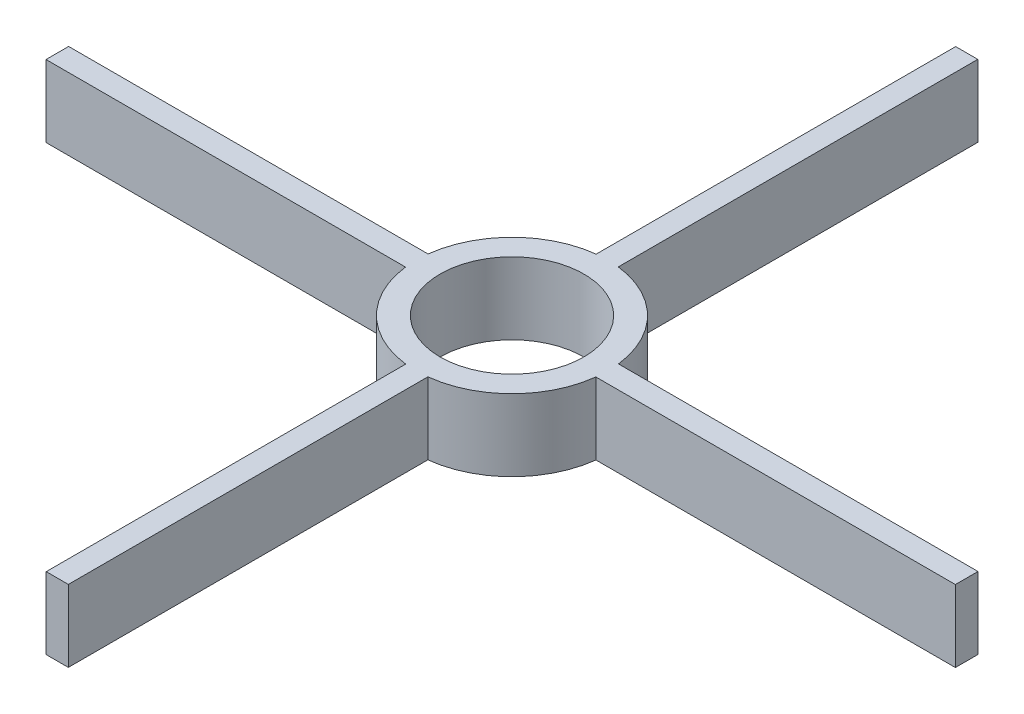
ISO-10303-21;
HEADER;
FILE_DESCRIPTION(('STEP AP214'),'2;1');
FILE_NAME('part.step','',(''),(''),'','','');
FILE_SCHEMA(('AUTOMOTIVE_DESIGN { 1 0 10303 214 1 1 1 1 }'));
ENDSEC;
DATA;
#1=APPLICATION_CONTEXT('core data for automotive mechanical design processes');
#2=APPLICATION_PROTOCOL_DEFINITION('international standard','automotive_design',2000,#1);
#3=PRODUCT_CONTEXT('',#1,'mechanical');
#4=PRODUCT('Part','Part','',(#3));
#5=PRODUCT_RELATED_PRODUCT_CATEGORY('part','',(#4));
#6=PRODUCT_DEFINITION_FORMATION('','',#4);
#7=PRODUCT_DEFINITION_CONTEXT('part definition',#1,'design');
#8=PRODUCT_DEFINITION('design','',#6,#7);
#9=PRODUCT_DEFINITION_SHAPE('','',#8);
#10=(LENGTH_UNIT() NAMED_UNIT(*) SI_UNIT(.MILLI.,.METRE.));
#11=(NAMED_UNIT(*) PLANE_ANGLE_UNIT() SI_UNIT($,.RADIAN.));
#12=(NAMED_UNIT(*) SI_UNIT($,.STERADIAN.) SOLID_ANGLE_UNIT());
#13=UNCERTAINTY_MEASURE_WITH_UNIT(LENGTH_MEASURE(1.E-05),#10,'distance_accuracy_value','');
#14=(GEOMETRIC_REPRESENTATION_CONTEXT(3) GLOBAL_UNCERTAINTY_ASSIGNED_CONTEXT((#13)) GLOBAL_UNIT_ASSIGNED_CONTEXT((#10,
#11,#12)) REPRESENTATION_CONTEXT('',''));
#15=CARTESIAN_POINT('',(0.,0.,0.));
#16=DIRECTION('',(0.,0.,1.));
#17=DIRECTION('',(1.,0.,0.));
#18=AXIS2_PLACEMENT_3D('',#15,#16,#17);
#19=CARTESIAN_POINT('',(0.,15.,0.));
#20=DIRECTION('',(0.,1.,0.));
#21=DIRECTION('',(0.,0.,1.));
#22=AXIS2_PLACEMENT_3D('',#19,#20,#21);
#23=PLANE('',#22);
#24=CARTESIAN_POINT('',(0.,15.,0.));
#25=DIRECTION('',(0.,1.,0.));
#26=DIRECTION('',(0.,0.,1.));
#27=AXIS2_PLACEMENT_3D('',#24,#25,#26);
#28=CIRCLE('',#27,40.);
#29=CARTESIAN_POINT('',(39.7205155794687,15.,-4.72023750474311));
#30=VERTEX_POINT('',#29);
#31=CARTESIAN_POINT('',(4.61486953120711,15.,-39.7328954294793));
#32=VERTEX_POINT('',#31);
#33=EDGE_CURVE('E212',#30,#32,#28,.T.);
#34=ORIENTED_EDGE('',*,*,#33,.T.);
#35=DIRECTION('',(0.,0.,-1.));
#36=VECTOR('',#35,1.);
#37=CARTESIAN_POINT('',(4.61486953120711,15.,-39.7328954294793));
#38=LINE('',#37,#36);
#39=CARTESIAN_POINT('',(4.61486953120711,15.,-189.732895429479));
#40=VERTEX_POINT('',#39);
#41=EDGE_CURVE('E120',#32,#40,#38,.T.);
#42=ORIENTED_EDGE('',*,*,#41,.T.);
#43=DIRECTION('',(-1.,0.,0.));
#44=VECTOR('',#43,1.);
#45=CARTESIAN_POINT('',(4.61486953120711,15.,-189.732895429479));
#46=LINE('',#45,#44);
#47=CARTESIAN_POINT('',(-4.61486953120713,15.,-189.732895429479));
#48=VERTEX_POINT('',#47);
#49=EDGE_CURVE('E251',#40,#48,#46,.T.);
#50=ORIENTED_EDGE('',*,*,#49,.T.);
#51=DIRECTION('',(0.,0.,1.));
#52=VECTOR('',#51,1.);
#53=CARTESIAN_POINT('',(-4.61486953120711,15.,-39.7328954294793));
#54=LINE('',#53,#52);
#55=CARTESIAN_POINT('',(-4.61486953120711,15.,-39.7328954294793));
#56=VERTEX_POINT('',#55);
#57=EDGE_CURVE('E270',#48,#56,#54,.T.);
#58=ORIENTED_EDGE('',*,*,#57,.T.);
#59=CARTESIAN_POINT('',(0.,15.,0.));
#60=DIRECTION('',(0.,1.,0.));
#61=DIRECTION('',(0.,0.,-1.));
#62=AXIS2_PLACEMENT_3D('',#59,#60,#61);
#63=CIRCLE('',#62,40.);
#64=CARTESIAN_POINT('',(-39.7205155794687,15.,-4.7202375047431));
#65=VERTEX_POINT('',#64);
#66=EDGE_CURVE('E267',#56,#65,#63,.T.);
#67=ORIENTED_EDGE('',*,*,#66,.T.);
#68=DIRECTION('',(-1.,0.,0.));
#69=VECTOR('',#68,1.);
#70=CARTESIAN_POINT('',(-189.720515579469,15.,-4.72023750474309));
#71=LINE('',#70,#69);
#72=CARTESIAN_POINT('',(-189.720515579469,15.,-4.72023750474309));
#73=VERTEX_POINT('',#72);
#74=EDGE_CURVE('E269',#65,#73,#71,.T.);
#75=ORIENTED_EDGE('',*,*,#74,.T.);
#76=DIRECTION('',(0.,0.,1.));
#77=VECTOR('',#76,1.);
#78=CARTESIAN_POINT('',(-189.720515579469,15.,4.72023750474313));
#79=LINE('',#78,#77);
#80=CARTESIAN_POINT('',(-189.720515579469,15.,4.72023750474313));
#81=VERTEX_POINT('',#80);
#82=EDGE_CURVE('E272',#73,#81,#79,.T.);
#83=ORIENTED_EDGE('',*,*,#82,.T.);
#84=DIRECTION('',(1.,0.,0.));
#85=VECTOR('',#84,1.);
#86=CARTESIAN_POINT('',(-189.720515579469,15.,4.72023750474313));
#87=LINE('',#86,#85);
#88=CARTESIAN_POINT('',(-39.7205155794687,15.,4.7202375047431));
#89=VERTEX_POINT('',#88);
#90=EDGE_CURVE('E278',#81,#89,#87,.T.);
#91=ORIENTED_EDGE('',*,*,#90,.T.);
#92=CARTESIAN_POINT('',(0.,15.,0.));
#93=DIRECTION('',(0.,1.,0.));
#94=DIRECTION('',(0.,0.,-1.));
#95=AXIS2_PLACEMENT_3D('',#92,#93,#94);
#96=CIRCLE('',#95,40.);
#97=CARTESIAN_POINT('',(-4.6148695312071,15.,39.7328954294793));
#98=VERTEX_POINT('',#97);
#99=EDGE_CURVE('E280',#89,#98,#96,.T.);
#100=ORIENTED_EDGE('',*,*,#99,.T.);
#101=DIRECTION('',(0.,0.,1.));
#102=VECTOR('',#101,1.);
#103=CARTESIAN_POINT('',(-4.61486953120704,15.,189.732895429479));
#104=LINE('',#103,#102);
#105=CARTESIAN_POINT('',(-4.61486953120704,15.,189.732895429479));
#106=VERTEX_POINT('',#105);
#107=EDGE_CURVE('E282',#98,#106,#104,.T.);
#108=ORIENTED_EDGE('',*,*,#107,.T.);
#109=DIRECTION('',(1.,0.,0.));
#110=VECTOR('',#109,1.);
#111=CARTESIAN_POINT('',(4.61486953120711,15.,189.732895429479));
#112=LINE('',#111,#110);
#113=CARTESIAN_POINT('',(4.61486953120711,15.,189.732895429479));
#114=VERTEX_POINT('',#113);
#115=EDGE_CURVE('E284',#106,#114,#112,.T.);
#116=ORIENTED_EDGE('',*,*,#115,.T.);
#117=DIRECTION('',(0.,0.,-1.));
#118=VECTOR('',#117,1.);
#119=CARTESIAN_POINT('',(4.61486953120711,15.,189.732895429479));
#120=LINE('',#119,#118);
#121=CARTESIAN_POINT('',(4.61486953120711,15.,39.7328954294793));
#122=VERTEX_POINT('',#121);
#123=EDGE_CURVE('E286',#114,#122,#120,.T.);
#124=ORIENTED_EDGE('',*,*,#123,.T.);
#125=CARTESIAN_POINT('',(0.,15.,0.));
#126=DIRECTION('',(0.,1.,0.));
#127=DIRECTION('',(0.,0.,1.));
#128=AXIS2_PLACEMENT_3D('',#125,#126,#127);
#129=CIRCLE('',#128,40.);
#130=CARTESIAN_POINT('',(39.7205155794687,15.,4.7202375047431));
#131=VERTEX_POINT('',#130);
#132=EDGE_CURVE('E163',#122,#131,#129,.T.);
#133=ORIENTED_EDGE('',*,*,#132,.T.);
#134=DIRECTION('',(1.,0.,0.));
#135=VECTOR('',#134,1.);
#136=CARTESIAN_POINT('',(189.720515579469,15.,4.72023750474308));
#137=LINE('',#136,#135);
#138=CARTESIAN_POINT('',(189.720515579469,15.,4.72023750474308));
#139=VERTEX_POINT('',#138);
#140=EDGE_CURVE('E157',#131,#139,#137,.T.);
#141=ORIENTED_EDGE('',*,*,#140,.T.);
#142=DIRECTION('',(0.,0.,-1.));
#143=VECTOR('',#142,1.);
#144=CARTESIAN_POINT('',(189.720515579469,15.,4.72023750474308));
#145=LINE('',#144,#143);
#146=CARTESIAN_POINT('',(189.720515579469,15.,-4.72023750474314));
#147=VERTEX_POINT('',#146);
#148=EDGE_CURVE('E161',#139,#147,#145,.T.);
#149=ORIENTED_EDGE('',*,*,#148,.T.);
#150=DIRECTION('',(-1.,0.,0.));
#151=VECTOR('',#150,1.);
#152=CARTESIAN_POINT('',(189.720515579469,15.,-4.72023750474314));
#153=LINE('',#152,#151);
#154=EDGE_CURVE('E53',#147,#30,#153,.T.);
#155=ORIENTED_EDGE('',*,*,#154,.T.);
#156=EDGE_LOOP('',(#34,#42,#50,#58,#67,#75,#83,#91,#100,#108,#116,#124,#133,#141,#149,#155));
#157=FACE_BOUND('',#156,.T.);
#158=CARTESIAN_POINT('',(0.,15.,0.));
#159=DIRECTION('',(0.,1.,0.));
#160=DIRECTION('',(0.,0.,1.));
#161=AXIS2_PLACEMENT_3D('',#158,#159,#160);
#162=CIRCLE('',#161,30.);
#163=CARTESIAN_POINT('',(0.,15.,30.));
#164=VERTEX_POINT('',#163);
#165=EDGE_CURVE('E185',#164,#164,#162,.T.);
#166=ORIENTED_EDGE('',*,*,#165,.F.);
#167=EDGE_LOOP('',(#166));
#168=FACE_BOUND('',#167,.T.);
#169=ADVANCED_FACE('F36',(#157,#168),#23,.T.);
#170=CARTESIAN_POINT('',(0.,-15.,0.));
#171=DIRECTION('',(0.,1.,0.));
#172=DIRECTION('',(0.,0.,1.));
#173=AXIS2_PLACEMENT_3D('',#170,#171,#172);
#174=PLANE('',#173);
#175=CARTESIAN_POINT('',(0.,-15.,0.));
#176=DIRECTION('',(0.,1.,0.));
#177=DIRECTION('',(0.,0.,1.));
#178=AXIS2_PLACEMENT_3D('',#175,#176,#177);
#179=CIRCLE('',#178,40.);
#180=CARTESIAN_POINT('',(39.7205155794687,-15.,-4.72023750474311));
#181=VERTEX_POINT('',#180);
#182=CARTESIAN_POINT('',(4.61486953120711,-15.,-39.7328954294793));
#183=VERTEX_POINT('',#182);
#184=EDGE_CURVE('E181',#181,#183,#179,.T.);
#185=ORIENTED_EDGE('',*,*,#184,.F.);
#186=DIRECTION('',(-1.,0.,0.));
#187=VECTOR('',#186,1.);
#188=CARTESIAN_POINT('',(189.720515579469,-15.,-4.72023750474314));
#189=LINE('',#188,#187);
#190=CARTESIAN_POINT('',(189.720515579469,-15.,-4.72023750474314));
#191=VERTEX_POINT('',#190);
#192=EDGE_CURVE('E112',#191,#181,#189,.T.);
#193=ORIENTED_EDGE('',*,*,#192,.F.);
#194=DIRECTION('',(0.,0.,-1.));
#195=VECTOR('',#194,1.);
#196=CARTESIAN_POINT('',(189.720515579469,-15.,4.72023750474308));
#197=LINE('',#196,#195);
#198=CARTESIAN_POINT('',(189.720515579469,-15.,4.72023750474308));
#199=VERTEX_POINT('',#198);
#200=EDGE_CURVE('E106',#199,#191,#197,.T.);
#201=ORIENTED_EDGE('',*,*,#200,.F.);
#202=DIRECTION('',(1.,0.,0.));
#203=VECTOR('',#202,1.);
#204=CARTESIAN_POINT('',(189.720515579469,-15.,4.72023750474308));
#205=LINE('',#204,#203);
#206=CARTESIAN_POINT('',(39.7205155794687,-15.,4.7202375047431));
#207=VERTEX_POINT('',#206);
#208=EDGE_CURVE('E171',#207,#199,#205,.T.);
#209=ORIENTED_EDGE('',*,*,#208,.F.);
#210=CARTESIAN_POINT('',(0.,-15.,0.));
#211=DIRECTION('',(0.,1.,0.));
#212=DIRECTION('',(0.,0.,1.));
#213=AXIS2_PLACEMENT_3D('',#210,#211,#212);
#214=CIRCLE('',#213,40.);
#215=CARTESIAN_POINT('',(4.61486953120711,-15.,39.7328954294793));
#216=VERTEX_POINT('',#215);
#217=EDGE_CURVE('E207',#216,#207,#214,.T.);
#218=ORIENTED_EDGE('',*,*,#217,.F.);
#219=DIRECTION('',(0.,0.,-1.));
#220=VECTOR('',#219,1.);
#221=CARTESIAN_POINT('',(4.61486953120711,-15.,189.732895429479));
#222=LINE('',#221,#220);
#223=CARTESIAN_POINT('',(4.61486953120711,-15.,189.732895429479));
#224=VERTEX_POINT('',#223);
#225=EDGE_CURVE('E205',#224,#216,#222,.T.);
#226=ORIENTED_EDGE('',*,*,#225,.F.);
#227=DIRECTION('',(1.,0.,0.));
#228=VECTOR('',#227,1.);
#229=CARTESIAN_POINT('',(4.61486953120711,-15.,189.732895429479));
#230=LINE('',#229,#228);
#231=CARTESIAN_POINT('',(-4.61486953120704,-15.,189.732895429479));
#232=VERTEX_POINT('',#231);
#233=EDGE_CURVE('E203',#232,#224,#230,.T.);
#234=ORIENTED_EDGE('',*,*,#233,.F.);
#235=DIRECTION('',(0.,0.,1.));
#236=VECTOR('',#235,1.);
#237=CARTESIAN_POINT('',(-4.61486953120704,-15.,189.732895429479));
#238=LINE('',#237,#236);
#239=CARTESIAN_POINT('',(-4.6148695312071,-15.,39.7328954294793));
#240=VERTEX_POINT('',#239);
#241=EDGE_CURVE('E201',#240,#232,#238,.T.);
#242=ORIENTED_EDGE('',*,*,#241,.F.);
#243=CARTESIAN_POINT('',(0.,-15.,0.));
#244=DIRECTION('',(0.,1.,0.));
#245=DIRECTION('',(0.,0.,-1.));
#246=AXIS2_PLACEMENT_3D('',#243,#244,#245);
#247=CIRCLE('',#246,40.);
#248=CARTESIAN_POINT('',(-39.7205155794687,-15.,4.7202375047431));
#249=VERTEX_POINT('',#248);
#250=EDGE_CURVE('E199',#249,#240,#247,.T.);
#251=ORIENTED_EDGE('',*,*,#250,.F.);
#252=DIRECTION('',(1.,0.,0.));
#253=VECTOR('',#252,1.);
#254=CARTESIAN_POINT('',(-189.720515579469,-15.,4.72023750474313));
#255=LINE('',#254,#253);
#256=CARTESIAN_POINT('',(-189.720515579469,-15.,4.72023750474313));
#257=VERTEX_POINT('',#256);
#258=EDGE_CURVE('E197',#257,#249,#255,.T.);
#259=ORIENTED_EDGE('',*,*,#258,.F.);
#260=DIRECTION('',(0.,0.,1.));
#261=VECTOR('',#260,1.);
#262=CARTESIAN_POINT('',(-189.720515579469,-15.,4.72023750474313));
#263=LINE('',#262,#261);
#264=CARTESIAN_POINT('',(-189.720515579469,-15.,-4.72023750474309));
#265=VERTEX_POINT('',#264);
#266=EDGE_CURVE('E195',#265,#257,#263,.T.);
#267=ORIENTED_EDGE('',*,*,#266,.F.);
#268=DIRECTION('',(-1.,0.,0.));
#269=VECTOR('',#268,1.);
#270=CARTESIAN_POINT('',(-189.720515579469,-15.,-4.72023750474309));
#271=LINE('',#270,#269);
#272=CARTESIAN_POINT('',(-39.7205155794687,-15.,-4.7202375047431));
#273=VERTEX_POINT('',#272);
#274=EDGE_CURVE('E193',#273,#265,#271,.T.);
#275=ORIENTED_EDGE('',*,*,#274,.F.);
#276=CARTESIAN_POINT('',(0.,-15.,0.));
#277=DIRECTION('',(0.,1.,0.));
#278=DIRECTION('',(0.,0.,-1.));
#279=AXIS2_PLACEMENT_3D('',#276,#277,#278);
#280=CIRCLE('',#279,40.);
#281=CARTESIAN_POINT('',(-4.61486953120711,-15.,-39.7328954294793));
#282=VERTEX_POINT('',#281);
#283=EDGE_CURVE('E191',#282,#273,#280,.T.);
#284=ORIENTED_EDGE('',*,*,#283,.F.);
#285=DIRECTION('',(0.,0.,1.));
#286=VECTOR('',#285,1.);
#287=CARTESIAN_POINT('',(-4.61486953120711,-15.,-39.7328954294793));
#288=LINE('',#287,#286);
#289=CARTESIAN_POINT('',(-4.61486953120713,-15.,-189.732895429479));
#290=VERTEX_POINT('',#289);
#291=EDGE_CURVE('E189',#290,#282,#288,.T.);
#292=ORIENTED_EDGE('',*,*,#291,.F.);
#293=DIRECTION('',(-1.,0.,0.));
#294=VECTOR('',#293,1.);
#295=CARTESIAN_POINT('',(4.61486953120711,-15.,-189.732895429479));
#296=LINE('',#295,#294);
#297=CARTESIAN_POINT('',(4.61486953120711,-15.,-189.732895429479));
#298=VERTEX_POINT('',#297);
#299=EDGE_CURVE('E187',#298,#290,#296,.T.);
#300=ORIENTED_EDGE('',*,*,#299,.F.);
#301=DIRECTION('',(0.,0.,-1.));
#302=VECTOR('',#301,1.);
#303=CARTESIAN_POINT('',(4.61486953120711,-15.,-39.7328954294793));
#304=LINE('',#303,#302);
#305=EDGE_CURVE('E184',#183,#298,#304,.T.);
#306=ORIENTED_EDGE('',*,*,#305,.F.);
#307=EDGE_LOOP('',(#185,#193,#201,#209,#218,#226,#234,#242,#251,#259,#267,#275,#284,#292,#300,#306));
#308=FACE_BOUND('',#307,.T.);
#309=CARTESIAN_POINT('',(0.,-15.,0.));
#310=DIRECTION('',(0.,1.,0.));
#311=DIRECTION('',(0.,0.,1.));
#312=AXIS2_PLACEMENT_3D('',#309,#310,#311);
#313=CIRCLE('',#312,30.);
#314=CARTESIAN_POINT('',(0.,-15.,30.));
#315=VERTEX_POINT('',#314);
#316=EDGE_CURVE('E485',#315,#315,#313,.T.);
#317=ORIENTED_EDGE('',*,*,#316,.T.);
#318=EDGE_LOOP('',(#317));
#319=FACE_BOUND('',#318,.T.);
#320=ADVANCED_FACE('F255',(#308,#319),#174,.F.);
#321=CARTESIAN_POINT('',(0.,15.,0.));
#322=DIRECTION('',(0.,-1.,0.));
#323=DIRECTION('',(0.,0.,-1.));
#324=AXIS2_PLACEMENT_3D('',#321,#322,#323);
#325=CYLINDRICAL_SURFACE('',#324,40.);
#326=ORIENTED_EDGE('',*,*,#184,.T.);
#327=DIRECTION('',(0.,-1.,0.));
#328=VECTOR('',#327,1.);
#329=CARTESIAN_POINT('',(4.61486953120711,15.,-39.7328954294793));
#330=LINE('',#329,#328);
#331=EDGE_CURVE('E11',#32,#183,#330,.T.);
#332=ORIENTED_EDGE('',*,*,#331,.F.);
#333=ORIENTED_EDGE('',*,*,#33,.F.);
#334=DIRECTION('',(0.,-1.,0.));
#335=VECTOR('',#334,1.);
#336=CARTESIAN_POINT('',(39.7205155794687,15.,-4.72023750474311));
#337=LINE('',#336,#335);
#338=EDGE_CURVE('E177',#30,#181,#337,.T.);
#339=ORIENTED_EDGE('',*,*,#338,.T.);
#340=EDGE_LOOP('',(#326,#332,#333,#339));
#341=FACE_BOUND('',#340,.T.);
#342=ADVANCED_FACE('F38',(#341),#325,.T.);
#343=CARTESIAN_POINT('',(4.61486953120711,15.,-39.7328954294793));
#344=DIRECTION('',(-1.,0.,0.));
#345=DIRECTION('',(0.,0.,1.));
#346=AXIS2_PLACEMENT_3D('',#343,#344,#345);
#347=PLANE('',#346);
#348=ORIENTED_EDGE('',*,*,#305,.T.);
#349=DIRECTION('',(0.,-1.,0.));
#350=VECTOR('',#349,1.);
#351=CARTESIAN_POINT('',(4.61486953120711,15.,-189.732895429479));
#352=LINE('',#351,#350);
#353=EDGE_CURVE('E45',#40,#298,#352,.T.);
#354=ORIENTED_EDGE('',*,*,#353,.F.);
#355=ORIENTED_EDGE('',*,*,#41,.F.);
#356=ORIENTED_EDGE('',*,*,#331,.T.);
#357=EDGE_LOOP('',(#348,#354,#355,#356));
#358=FACE_BOUND('',#357,.T.);
#359=ADVANCED_FACE('F320',(#358),#347,.F.);
#360=CARTESIAN_POINT('',(4.61486953120711,15.,-189.732895429479));
#361=DIRECTION('',(0.,0.,1.));
#362=DIRECTION('',(1.,0.,0.));
#363=AXIS2_PLACEMENT_3D('',#360,#361,#362);
#364=PLANE('',#363);
#365=ORIENTED_EDGE('',*,*,#299,.T.);
#366=DIRECTION('',(0.,-1.,0.));
#367=VECTOR('',#366,1.);
#368=CARTESIAN_POINT('',(-4.61486953120713,15.,-189.732895429479));
#369=LINE('',#368,#367);
#370=EDGE_CURVE('E243',#48,#290,#369,.T.);
#371=ORIENTED_EDGE('',*,*,#370,.F.);
#372=ORIENTED_EDGE('',*,*,#49,.F.);
#373=ORIENTED_EDGE('',*,*,#353,.T.);
#374=EDGE_LOOP('',(#365,#371,#372,#373));
#375=FACE_BOUND('',#374,.T.);
#376=ADVANCED_FACE('F249',(#375),#364,.F.);
#377=CARTESIAN_POINT('',(-4.61486953120711,15.,-39.7328954294793));
#378=DIRECTION('',(1.,0.,0.));
#379=DIRECTION('',(0.,0.,-1.));
#380=AXIS2_PLACEMENT_3D('',#377,#378,#379);
#381=PLANE('',#380);
#382=ORIENTED_EDGE('',*,*,#291,.T.);
#383=DIRECTION('',(0.,-1.,0.));
#384=VECTOR('',#383,1.);
#385=CARTESIAN_POINT('',(-4.61486953120711,15.,-39.7328954294793));
#386=LINE('',#385,#384);
#387=EDGE_CURVE('E240',#56,#282,#386,.T.);
#388=ORIENTED_EDGE('',*,*,#387,.F.);
#389=ORIENTED_EDGE('',*,*,#57,.F.);
#390=ORIENTED_EDGE('',*,*,#370,.T.);
#391=EDGE_LOOP('',(#382,#388,#389,#390));
#392=FACE_BOUND('',#391,.T.);
#393=ADVANCED_FACE('F261',(#392),#381,.F.);
#394=CARTESIAN_POINT('',(0.,15.,0.));
#395=DIRECTION('',(0.,-1.,0.));
#396=DIRECTION('',(0.,0.,-1.));
#397=AXIS2_PLACEMENT_3D('',#394,#395,#396);
#398=CYLINDRICAL_SURFACE('',#397,40.);
#399=ORIENTED_EDGE('',*,*,#283,.T.);
#400=DIRECTION('',(0.,-1.,0.));
#401=VECTOR('',#400,1.);
#402=CARTESIAN_POINT('',(-39.7205155794687,15.,-4.7202375047431));
#403=LINE('',#402,#401);
#404=EDGE_CURVE('E237',#65,#273,#403,.T.);
#405=ORIENTED_EDGE('',*,*,#404,.F.);
#406=ORIENTED_EDGE('',*,*,#66,.F.);
#407=ORIENTED_EDGE('',*,*,#387,.T.);
#408=EDGE_LOOP('',(#399,#405,#406,#407));
#409=FACE_BOUND('',#408,.T.);
#410=ADVANCED_FACE('F265',(#409),#398,.T.);
#411=CARTESIAN_POINT('',(-189.720515579469,15.,-4.72023750474309));
#412=DIRECTION('',(0.,0.,1.));
#413=DIRECTION('',(1.,0.,0.));
#414=AXIS2_PLACEMENT_3D('',#411,#412,#413);
#415=PLANE('',#414);
#416=ORIENTED_EDGE('',*,*,#274,.T.);
#417=DIRECTION('',(0.,-1.,0.));
#418=VECTOR('',#417,1.);
#419=CARTESIAN_POINT('',(-189.720515579469,15.,-4.72023750474309));
#420=LINE('',#419,#418);
#421=EDGE_CURVE('E234',#73,#265,#420,.T.);
#422=ORIENTED_EDGE('',*,*,#421,.F.);
#423=ORIENTED_EDGE('',*,*,#74,.F.);
#424=ORIENTED_EDGE('',*,*,#404,.T.);
#425=EDGE_LOOP('',(#416,#422,#423,#424));
#426=FACE_BOUND('',#425,.T.);
#427=ADVANCED_FACE('F333',(#426),#415,.F.);
#428=CARTESIAN_POINT('',(-189.720515579469,15.,4.72023750474313));
#429=DIRECTION('',(1.,0.,0.));
#430=DIRECTION('',(0.,0.,-1.));
#431=AXIS2_PLACEMENT_3D('',#428,#429,#430);
#432=PLANE('',#431);
#433=ORIENTED_EDGE('',*,*,#266,.T.);
#434=DIRECTION('',(0.,-1.,0.));
#435=VECTOR('',#434,1.);
#436=CARTESIAN_POINT('',(-189.720515579469,15.,4.72023750474313));
#437=LINE('',#436,#435);
#438=EDGE_CURVE('E231',#81,#257,#437,.T.);
#439=ORIENTED_EDGE('',*,*,#438,.F.);
#440=ORIENTED_EDGE('',*,*,#82,.F.);
#441=ORIENTED_EDGE('',*,*,#421,.T.);
#442=EDGE_LOOP('',(#433,#439,#440,#441));
#443=FACE_BOUND('',#442,.T.);
#444=ADVANCED_FACE('F336',(#443),#432,.F.);
#445=CARTESIAN_POINT('',(-189.720515579469,15.,4.72023750474313));
#446=DIRECTION('',(0.,0.,-1.));
#447=DIRECTION('',(-1.,0.,0.));
#448=AXIS2_PLACEMENT_3D('',#445,#446,#447);
#449=PLANE('',#448);
#450=ORIENTED_EDGE('',*,*,#258,.T.);
#451=DIRECTION('',(0.,-1.,0.));
#452=VECTOR('',#451,1.);
#453=CARTESIAN_POINT('',(-39.7205155794687,15.,4.7202375047431));
#454=LINE('',#453,#452);
#455=EDGE_CURVE('E228',#89,#249,#454,.T.);
#456=ORIENTED_EDGE('',*,*,#455,.F.);
#457=ORIENTED_EDGE('',*,*,#90,.F.);
#458=ORIENTED_EDGE('',*,*,#438,.T.);
#459=EDGE_LOOP('',(#450,#456,#457,#458));
#460=FACE_BOUND('',#459,.T.);
#461=ADVANCED_FACE('F340',(#460),#449,.F.);
#462=CARTESIAN_POINT('',(0.,15.,0.));
#463=DIRECTION('',(0.,-1.,0.));
#464=DIRECTION('',(0.,0.,-1.));
#465=AXIS2_PLACEMENT_3D('',#462,#463,#464);
#466=CYLINDRICAL_SURFACE('',#465,40.);
#467=ORIENTED_EDGE('',*,*,#250,.T.);
#468=DIRECTION('',(0.,-1.,0.));
#469=VECTOR('',#468,1.);
#470=CARTESIAN_POINT('',(-4.6148695312071,15.,39.7328954294793));
#471=LINE('',#470,#469);
#472=EDGE_CURVE('E225',#98,#240,#471,.T.);
#473=ORIENTED_EDGE('',*,*,#472,.F.);
#474=ORIENTED_EDGE('',*,*,#99,.F.);
#475=ORIENTED_EDGE('',*,*,#455,.T.);
#476=EDGE_LOOP('',(#467,#473,#474,#475));
#477=FACE_BOUND('',#476,.T.);
#478=ADVANCED_FACE('F344',(#477),#466,.T.);
#479=CARTESIAN_POINT('',(-4.61486953120704,15.,189.732895429479));
#480=DIRECTION('',(1.,0.,0.));
#481=DIRECTION('',(0.,0.,-1.));
#482=AXIS2_PLACEMENT_3D('',#479,#480,#481);
#483=PLANE('',#482);
#484=ORIENTED_EDGE('',*,*,#241,.T.);
#485=DIRECTION('',(0.,-1.,0.));
#486=VECTOR('',#485,1.);
#487=CARTESIAN_POINT('',(-4.61486953120704,15.,189.732895429479));
#488=LINE('',#487,#486);
#489=EDGE_CURVE('E222',#106,#232,#488,.T.);
#490=ORIENTED_EDGE('',*,*,#489,.F.);
#491=ORIENTED_EDGE('',*,*,#107,.F.);
#492=ORIENTED_EDGE('',*,*,#472,.T.);
#493=EDGE_LOOP('',(#484,#490,#491,#492));
#494=FACE_BOUND('',#493,.T.);
#495=ADVANCED_FACE('F348',(#494),#483,.F.);
#496=CARTESIAN_POINT('',(4.61486953120711,15.,189.732895429479));
#497=DIRECTION('',(0.,0.,-1.));
#498=DIRECTION('',(-1.,0.,0.));
#499=AXIS2_PLACEMENT_3D('',#496,#497,#498);
#500=PLANE('',#499);
#501=ORIENTED_EDGE('',*,*,#233,.T.);
#502=DIRECTION('',(0.,-1.,0.));
#503=VECTOR('',#502,1.);
#504=CARTESIAN_POINT('',(4.61486953120711,15.,189.732895429479));
#505=LINE('',#504,#503);
#506=EDGE_CURVE('E219',#114,#224,#505,.T.);
#507=ORIENTED_EDGE('',*,*,#506,.F.);
#508=ORIENTED_EDGE('',*,*,#115,.F.);
#509=ORIENTED_EDGE('',*,*,#489,.T.);
#510=EDGE_LOOP('',(#501,#507,#508,#509));
#511=FACE_BOUND('',#510,.T.);
#512=ADVANCED_FACE('F352',(#511),#500,.F.);
#513=CARTESIAN_POINT('',(4.61486953120711,15.,189.732895429479));
#514=DIRECTION('',(-1.,0.,0.));
#515=DIRECTION('',(0.,0.,1.));
#516=AXIS2_PLACEMENT_3D('',#513,#514,#515);
#517=PLANE('',#516);
#518=ORIENTED_EDGE('',*,*,#225,.T.);
#519=DIRECTION('',(0.,-1.,0.));
#520=VECTOR('',#519,1.);
#521=CARTESIAN_POINT('',(4.61486953120711,15.,39.7328954294793));
#522=LINE('',#521,#520);
#523=EDGE_CURVE('E216',#122,#216,#522,.T.);
#524=ORIENTED_EDGE('',*,*,#523,.F.);
#525=ORIENTED_EDGE('',*,*,#123,.F.);
#526=ORIENTED_EDGE('',*,*,#506,.T.);
#527=EDGE_LOOP('',(#518,#524,#525,#526));
#528=FACE_BOUND('',#527,.T.);
#529=ADVANCED_FACE('F292',(#528),#517,.F.);
#530=CARTESIAN_POINT('',(0.,15.,0.));
#531=DIRECTION('',(0.,-1.,0.));
#532=DIRECTION('',(0.,0.,-1.));
#533=AXIS2_PLACEMENT_3D('',#530,#531,#532);
#534=CYLINDRICAL_SURFACE('',#533,40.);
#535=ORIENTED_EDGE('',*,*,#217,.T.);
#536=DIRECTION('',(0.,-1.,0.));
#537=VECTOR('',#536,1.);
#538=CARTESIAN_POINT('',(39.7205155794687,15.,4.7202375047431));
#539=LINE('',#538,#537);
#540=EDGE_CURVE('E172',#131,#207,#539,.T.);
#541=ORIENTED_EDGE('',*,*,#540,.F.);
#542=ORIENTED_EDGE('',*,*,#132,.F.);
#543=ORIENTED_EDGE('',*,*,#523,.T.);
#544=EDGE_LOOP('',(#535,#541,#542,#543));
#545=FACE_BOUND('',#544,.T.);
#546=ADVANCED_FACE('F296',(#545),#534,.T.);
#547=CARTESIAN_POINT('',(189.720515579469,15.,4.72023750474308));
#548=DIRECTION('',(0.,0.,-1.));
#549=DIRECTION('',(-1.,0.,0.));
#550=AXIS2_PLACEMENT_3D('',#547,#548,#549);
#551=PLANE('',#550);
#552=ORIENTED_EDGE('',*,*,#208,.T.);
#553=DIRECTION('',(0.,-1.,0.));
#554=VECTOR('',#553,1.);
#555=CARTESIAN_POINT('',(189.720515579469,15.,4.72023750474308));
#556=LINE('',#555,#554);
#557=EDGE_CURVE('E168',#139,#199,#556,.T.);
#558=ORIENTED_EDGE('',*,*,#557,.F.);
#559=ORIENTED_EDGE('',*,*,#140,.F.);
#560=ORIENTED_EDGE('',*,*,#540,.T.);
#561=EDGE_LOOP('',(#552,#558,#559,#560));
#562=FACE_BOUND('',#561,.T.);
#563=ADVANCED_FACE('F169',(#562),#551,.F.);
#564=CARTESIAN_POINT('',(189.720515579469,15.,4.72023750474308));
#565=DIRECTION('',(-1.,0.,0.));
#566=DIRECTION('',(0.,0.,1.));
#567=AXIS2_PLACEMENT_3D('',#564,#565,#566);
#568=PLANE('',#567);
#569=ORIENTED_EDGE('',*,*,#200,.T.);
#570=DIRECTION('',(0.,-1.,0.));
#571=VECTOR('',#570,1.);
#572=CARTESIAN_POINT('',(189.720515579469,15.,-4.72023750474314));
#573=LINE('',#572,#571);
#574=EDGE_CURVE('E173',#147,#191,#573,.T.);
#575=ORIENTED_EDGE('',*,*,#574,.F.);
#576=ORIENTED_EDGE('',*,*,#148,.F.);
#577=ORIENTED_EDGE('',*,*,#557,.T.);
#578=EDGE_LOOP('',(#569,#575,#576,#577));
#579=FACE_BOUND('',#578,.T.);
#580=ADVANCED_FACE('F175',(#579),#568,.F.);
#581=CARTESIAN_POINT('',(189.720515579469,15.,-4.72023750474314));
#582=DIRECTION('',(0.,0.,1.));
#583=DIRECTION('',(1.,0.,0.));
#584=AXIS2_PLACEMENT_3D('',#581,#582,#583);
#585=PLANE('',#584);
#586=ORIENTED_EDGE('',*,*,#192,.T.);
#587=ORIENTED_EDGE('',*,*,#338,.F.);
#588=ORIENTED_EDGE('',*,*,#154,.F.);
#589=ORIENTED_EDGE('',*,*,#574,.T.);
#590=EDGE_LOOP('',(#586,#587,#588,#589));
#591=FACE_BOUND('',#590,.T.);
#592=ADVANCED_FACE('F300',(#591),#585,.F.);
#593=CARTESIAN_POINT('',(0.,15.,0.));
#594=DIRECTION('',(0.,-1.,0.));
#595=DIRECTION('',(0.,0.,-1.));
#596=AXIS2_PLACEMENT_3D('',#593,#594,#595);
#597=CYLINDRICAL_SURFACE('',#596,30.);
#598=ORIENTED_EDGE('',*,*,#165,.T.);
#599=EDGE_LOOP('',(#598));
#600=FACE_BOUND('',#599,.T.);
#601=ORIENTED_EDGE('',*,*,#316,.F.);
#602=EDGE_LOOP('',(#601));
#603=FACE_BOUND('',#602,.T.);
#604=ADVANCED_FACE('F302',(#600,#603),#597,.F.);
#605=CLOSED_SHELL('',(#169,#320,#342,#359,#376,#393,#410,#427,#444,#461,#478,#495,#512,#529,
#546,#563,#580,#592,#604));
#606=MANIFOLD_SOLID_BREP('B2',#605);
#607=ADVANCED_BREP_SHAPE_REPRESENTATION('',(#18,#606),#14);
#608=SHAPE_DEFINITION_REPRESENTATION(#9,#607);
ENDSEC;
END-ISO-10303-21;
